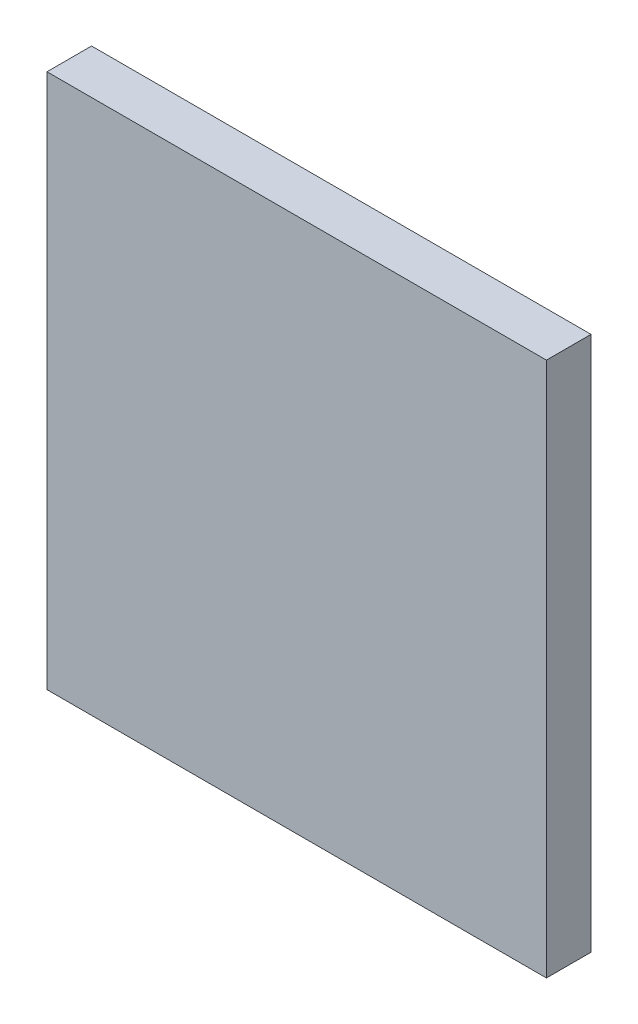
ISO-10303-21;
HEADER;
FILE_DESCRIPTION(('STEP AP214'),'2;1');
FILE_NAME('part.step','',(''),(''),'','','');
FILE_SCHEMA(('AUTOMOTIVE_DESIGN { 1 0 10303 214 1 1 1 1 }'));
ENDSEC;
DATA;
#1=APPLICATION_CONTEXT('core data for automotive mechanical design processes');
#2=APPLICATION_PROTOCOL_DEFINITION('international standard','automotive_design',2000,#1);
#3=PRODUCT_CONTEXT('',#1,'mechanical');
#4=PRODUCT('Part','Part','',(#3));
#5=PRODUCT_RELATED_PRODUCT_CATEGORY('part','',(#4));
#6=PRODUCT_DEFINITION_FORMATION('','',#4);
#7=PRODUCT_DEFINITION_CONTEXT('part definition',#1,'design');
#8=PRODUCT_DEFINITION('design','',#6,#7);
#9=PRODUCT_DEFINITION_SHAPE('','',#8);
#10=(LENGTH_UNIT() NAMED_UNIT(*) SI_UNIT(.MILLI.,.METRE.));
#11=(NAMED_UNIT(*) PLANE_ANGLE_UNIT() SI_UNIT($,.RADIAN.));
#12=(NAMED_UNIT(*) SI_UNIT($,.STERADIAN.) SOLID_ANGLE_UNIT());
#13=UNCERTAINTY_MEASURE_WITH_UNIT(LENGTH_MEASURE(1.E-05),#10,'distance_accuracy_value','');
#14=(GEOMETRIC_REPRESENTATION_CONTEXT(3) GLOBAL_UNCERTAINTY_ASSIGNED_CONTEXT((#13)) GLOBAL_UNIT_ASSIGNED_CONTEXT((#10,
#11,#12)) REPRESENTATION_CONTEXT('',''));
#15=CARTESIAN_POINT('',(0.,0.,0.));
#16=DIRECTION('',(0.,0.,1.));
#17=DIRECTION('',(1.,0.,0.));
#18=AXIS2_PLACEMENT_3D('',#15,#16,#17);
#19=CARTESIAN_POINT('',(0.,60.,5.));
#20=DIRECTION('',(1.,0.,0.));
#21=DIRECTION('',(0.,0.,-1.));
#22=AXIS2_PLACEMENT_3D('',#19,#20,#21);
#23=PLANE('',#22);
#24=DIRECTION('',(0.,-1.,0.));
#25=VECTOR('',#24,1.);
#26=CARTESIAN_POINT('',(0.,60.,0.));
#27=LINE('',#26,#25);
#28=CARTESIAN_POINT('',(0.,60.,0.));
#29=VERTEX_POINT('',#28);
#30=CARTESIAN_POINT('',(0.,0.,0.));
#31=VERTEX_POINT('',#30);
#32=EDGE_CURVE('E102',#29,#31,#27,.T.);
#33=ORIENTED_EDGE('',*,*,#32,.T.);
#34=DIRECTION('',(0.,0.,-1.));
#35=VECTOR('',#34,1.);
#36=CARTESIAN_POINT('',(0.,0.,5.));
#37=LINE('',#36,#35);
#38=CARTESIAN_POINT('',(0.,0.,5.));
#39=VERTEX_POINT('',#38);
#40=EDGE_CURVE('E11',#39,#31,#37,.T.);
#41=ORIENTED_EDGE('',*,*,#40,.F.);
#42=DIRECTION('',(0.,-1.,0.));
#43=VECTOR('',#42,1.);
#44=CARTESIAN_POINT('',(0.,60.,5.));
#45=LINE('',#44,#43);
#46=CARTESIAN_POINT('',(0.,60.,5.));
#47=VERTEX_POINT('',#46);
#48=EDGE_CURVE('E90',#47,#39,#45,.T.);
#49=ORIENTED_EDGE('',*,*,#48,.F.);
#50=DIRECTION('',(0.,0.,-1.));
#51=VECTOR('',#50,1.);
#52=CARTESIAN_POINT('',(0.,60.,5.));
#53=LINE('',#52,#51);
#54=EDGE_CURVE('E98',#47,#29,#53,.T.);
#55=ORIENTED_EDGE('',*,*,#54,.T.);
#56=EDGE_LOOP('',(#33,#41,#49,#55));
#57=FACE_BOUND('',#56,.T.);
#58=ADVANCED_FACE('F39',(#57),#23,.F.);
#59=CARTESIAN_POINT('',(0.,0.,5.));
#60=DIRECTION('',(0.,1.,0.));
#61=DIRECTION('',(0.,0.,1.));
#62=AXIS2_PLACEMENT_3D('',#59,#60,#61);
#63=PLANE('',#62);
#64=DIRECTION('',(1.,0.,0.));
#65=VECTOR('',#64,1.);
#66=CARTESIAN_POINT('',(0.,0.,0.));
#67=LINE('',#66,#65);
#68=CARTESIAN_POINT('',(56.,0.,0.));
#69=VERTEX_POINT('',#68);
#70=EDGE_CURVE('E94',#31,#69,#67,.T.);
#71=ORIENTED_EDGE('',*,*,#70,.T.);
#72=DIRECTION('',(0.,0.,-1.));
#73=VECTOR('',#72,1.);
#74=CARTESIAN_POINT('',(56.,0.,5.));
#75=LINE('',#74,#73);
#76=CARTESIAN_POINT('',(56.,0.,5.));
#77=VERTEX_POINT('',#76);
#78=EDGE_CURVE('E47',#77,#69,#75,.T.);
#79=ORIENTED_EDGE('',*,*,#78,.F.);
#80=DIRECTION('',(1.,0.,0.));
#81=VECTOR('',#80,1.);
#82=CARTESIAN_POINT('',(0.,0.,5.));
#83=LINE('',#82,#81);
#84=EDGE_CURVE('E85',#39,#77,#83,.T.);
#85=ORIENTED_EDGE('',*,*,#84,.F.);
#86=ORIENTED_EDGE('',*,*,#40,.T.);
#87=EDGE_LOOP('',(#71,#79,#85,#86));
#88=FACE_BOUND('',#87,.T.);
#89=ADVANCED_FACE('F93',(#88),#63,.F.);
#90=CARTESIAN_POINT('',(56.,0.,5.));
#91=DIRECTION('',(-1.,0.,0.));
#92=DIRECTION('',(0.,0.,1.));
#93=AXIS2_PLACEMENT_3D('',#90,#91,#92);
#94=PLANE('',#93);
#95=DIRECTION('',(0.,1.,0.));
#96=VECTOR('',#95,1.);
#97=CARTESIAN_POINT('',(56.,0.,0.));
#98=LINE('',#97,#96);
#99=CARTESIAN_POINT('',(56.,60.,0.));
#100=VERTEX_POINT('',#99);
#101=EDGE_CURVE('E72',#69,#100,#98,.T.);
#102=ORIENTED_EDGE('',*,*,#101,.T.);
#103=DIRECTION('',(0.,0.,-1.));
#104=VECTOR('',#103,1.);
#105=CARTESIAN_POINT('',(56.,60.,5.));
#106=LINE('',#105,#104);
#107=CARTESIAN_POINT('',(56.,60.,5.));
#108=VERTEX_POINT('',#107);
#109=EDGE_CURVE('E95',#108,#100,#106,.T.);
#110=ORIENTED_EDGE('',*,*,#109,.F.);
#111=DIRECTION('',(0.,1.,0.));
#112=VECTOR('',#111,1.);
#113=CARTESIAN_POINT('',(56.,0.,5.));
#114=LINE('',#113,#112);
#115=EDGE_CURVE('E88',#77,#108,#114,.T.);
#116=ORIENTED_EDGE('',*,*,#115,.F.);
#117=ORIENTED_EDGE('',*,*,#78,.T.);
#118=EDGE_LOOP('',(#102,#110,#116,#117));
#119=FACE_BOUND('',#118,.T.);
#120=ADVANCED_FACE('F96',(#119),#94,.F.);
#121=CARTESIAN_POINT('',(56.,60.,5.));
#122=DIRECTION('',(0.,-1.,0.));
#123=DIRECTION('',(0.,0.,-1.));
#124=AXIS2_PLACEMENT_3D('',#121,#122,#123);
#125=PLANE('',#124);
#126=DIRECTION('',(-1.,0.,0.));
#127=VECTOR('',#126,1.);
#128=CARTESIAN_POINT('',(56.,60.,0.));
#129=LINE('',#128,#127);
#130=EDGE_CURVE('E78',#100,#29,#129,.T.);
#131=ORIENTED_EDGE('',*,*,#130,.T.);
#132=ORIENTED_EDGE('',*,*,#54,.F.);
#133=DIRECTION('',(-1.,0.,0.));
#134=VECTOR('',#133,1.);
#135=CARTESIAN_POINT('',(56.,60.,5.));
#136=LINE('',#135,#134);
#137=EDGE_CURVE('E55',#108,#47,#136,.T.);
#138=ORIENTED_EDGE('',*,*,#137,.F.);
#139=ORIENTED_EDGE('',*,*,#109,.T.);
#140=EDGE_LOOP('',(#131,#132,#138,#139));
#141=FACE_BOUND('',#140,.T.);
#142=ADVANCED_FACE('F109',(#141),#125,.F.);
#143=CARTESIAN_POINT('',(0.,0.,5.));
#144=DIRECTION('',(0.,0.,1.));
#145=DIRECTION('',(1.,0.,0.));
#146=AXIS2_PLACEMENT_3D('',#143,#144,#145);
#147=PLANE('',#146);
#148=ORIENTED_EDGE('',*,*,#48,.T.);
#149=ORIENTED_EDGE('',*,*,#84,.T.);
#150=ORIENTED_EDGE('',*,*,#115,.T.);
#151=ORIENTED_EDGE('',*,*,#137,.T.);
#152=EDGE_LOOP('',(#148,#149,#150,#151));
#153=FACE_BOUND('',#152,.T.);
#154=ADVANCED_FACE('F86',(#153),#147,.T.);
#155=CARTESIAN_POINT('',(0.,0.,0.));
#156=DIRECTION('',(0.,0.,1.));
#157=DIRECTION('',(1.,0.,0.));
#158=AXIS2_PLACEMENT_3D('',#155,#156,#157);
#159=PLANE('',#158);
#160=ORIENTED_EDGE('',*,*,#32,.F.);
#161=ORIENTED_EDGE('',*,*,#130,.F.);
#162=ORIENTED_EDGE('',*,*,#101,.F.);
#163=ORIENTED_EDGE('',*,*,#70,.F.);
#164=EDGE_LOOP('',(#160,#161,#162,#163));
#165=FACE_BOUND('',#164,.T.);
#166=ADVANCED_FACE('F112',(#165),#159,.F.);
#167=CLOSED_SHELL('',(#58,#89,#120,#142,#154,#166));
#168=MANIFOLD_SOLID_BREP('B2',#167);
#169=ADVANCED_BREP_SHAPE_REPRESENTATION('',(#18,#168),#14);
#170=SHAPE_DEFINITION_REPRESENTATION(#9,#169);
ENDSEC;
END-ISO-10303-21;
